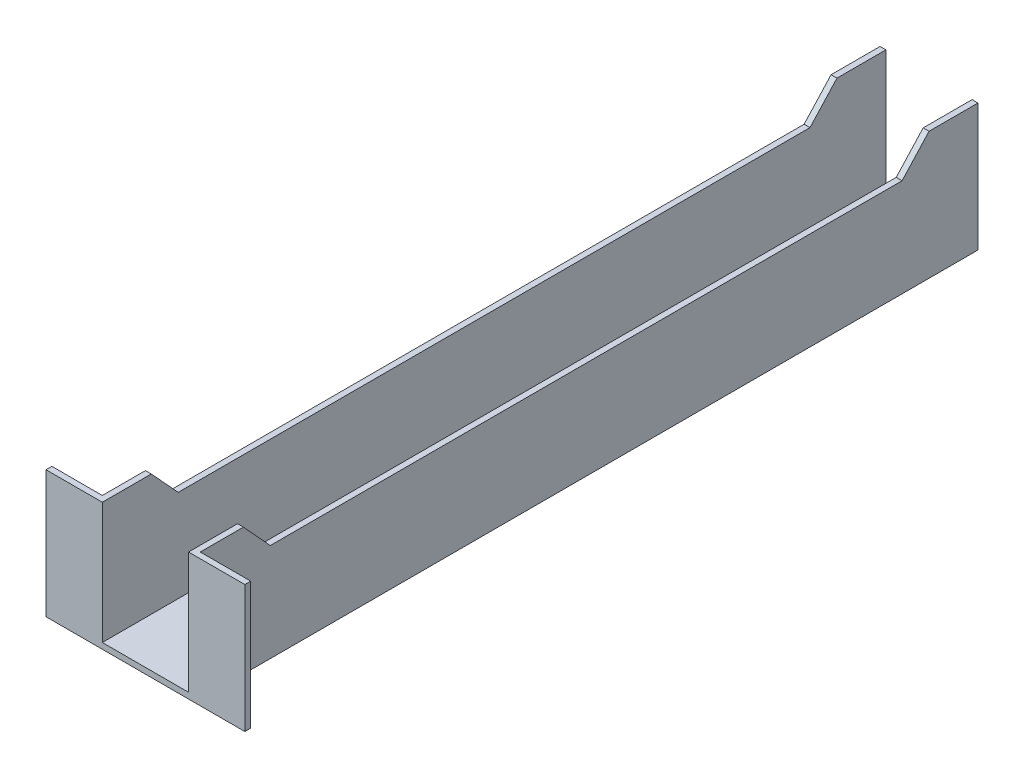
ISO-10303-21;
HEADER;
FILE_DESCRIPTION(('STEP AP214'),'2;1');
FILE_NAME('part.step','',(''),(''),'','','');
FILE_SCHEMA(('AUTOMOTIVE_DESIGN { 1 0 10303 214 1 1 1 1 }'));
ENDSEC;
DATA;
#1=APPLICATION_CONTEXT('core data for automotive mechanical design processes');
#2=APPLICATION_PROTOCOL_DEFINITION('international standard','automotive_design',2000,#1);
#3=PRODUCT_CONTEXT('',#1,'mechanical');
#4=PRODUCT('Part','Part','',(#3));
#5=PRODUCT_RELATED_PRODUCT_CATEGORY('part','',(#4));
#6=PRODUCT_DEFINITION_FORMATION('','',#4);
#7=PRODUCT_DEFINITION_CONTEXT('part definition',#1,'design');
#8=PRODUCT_DEFINITION('design','',#6,#7);
#9=PRODUCT_DEFINITION_SHAPE('','',#8);
#10=(LENGTH_UNIT() NAMED_UNIT(*) SI_UNIT(.MILLI.,.METRE.));
#11=(NAMED_UNIT(*) PLANE_ANGLE_UNIT() SI_UNIT($,.RADIAN.));
#12=(NAMED_UNIT(*) SI_UNIT($,.STERADIAN.) SOLID_ANGLE_UNIT());
#13=UNCERTAINTY_MEASURE_WITH_UNIT(LENGTH_MEASURE(1.E-05),#10,'distance_accuracy_value','');
#14=(GEOMETRIC_REPRESENTATION_CONTEXT(3) GLOBAL_UNCERTAINTY_ASSIGNED_CONTEXT((#13)) GLOBAL_UNIT_ASSIGNED_CONTEXT((#10,
#11,#12)) REPRESENTATION_CONTEXT('',''));
#15=CARTESIAN_POINT('',(0.,0.,0.));
#16=DIRECTION('',(0.,0.,1.));
#17=DIRECTION('',(1.,0.,0.));
#18=AXIS2_PLACEMENT_3D('',#15,#16,#17);
#19=CARTESIAN_POINT('',(-12.7,25.4,183.515));
#20=DIRECTION('',(0.,-1.,0.));
#21=DIRECTION('',(0.,0.,-1.));
#22=AXIS2_PLACEMENT_3D('',#19,#20,#21);
#23=PLANE('',#22);
#24=DIRECTION('',(0.,0.,1.));
#25=VECTOR('',#24,1.);
#26=CARTESIAN_POINT('',(-12.7,25.39999999238,100.838));
#27=LINE('',#26,#25);
#28=CARTESIAN_POINT('',(-12.7,25.39999999619,19.6850000034925));
#29=VERTEX_POINT('',#28);
#30=CARTESIAN_POINT('',(-12.7,25.39999999619,183.514999996507));
#31=VERTEX_POINT('',#30);
#32=EDGE_CURVE('E83',#29,#31,#27,.T.);
#33=ORIENTED_EDGE('',*,*,#32,.T.);
#34=DIRECTION('',(1.,0.,0.));
#35=VECTOR('',#34,1.);
#36=CARTESIAN_POINT('',(-11.938,25.4,183.515));
#37=LINE('',#36,#35);
#38=CARTESIAN_POINT('',(-11.176,25.399999997968,183.514999998137));
#39=VERTEX_POINT('',#38);
#40=EDGE_CURVE('E79',#31,#39,#37,.T.);
#41=ORIENTED_EDGE('',*,*,#40,.T.);
#42=DIRECTION('',(0.,0.,-1.));
#43=VECTOR('',#42,1.);
#44=CARTESIAN_POINT('',(-11.176,25.399999995936,101.6));
#45=LINE('',#44,#43);
#46=CARTESIAN_POINT('',(-11.176,25.399999997968,19.6850000018627));
#47=VERTEX_POINT('',#46);
#48=EDGE_CURVE('E82',#39,#47,#45,.T.);
#49=ORIENTED_EDGE('',*,*,#48,.T.);
#50=DIRECTION('',(1.,0.,0.));
#51=VECTOR('',#50,1.);
#52=CARTESIAN_POINT('',(-11.938,25.4,19.685));
#53=LINE('',#52,#51);
#54=EDGE_CURVE('E106',#29,#47,#53,.T.);
#55=ORIENTED_EDGE('',*,*,#54,.F.);
#56=EDGE_LOOP('',(#33,#41,#49,#55));
#57=FACE_BOUND('',#56,.T.);
#58=ADVANCED_FACE('F16',(#57),#23,.F.);
#59=CARTESIAN_POINT('',(-12.7,33.02,190.5));
#60=DIRECTION('',(0.,-0.675724628517347,0.737154140200741));
#61=DIRECTION('',(0.,-0.737154140200741,-0.675724628517347));
#62=AXIS2_PLACEMENT_3D('',#59,#60,#61);
#63=PLANE('',#62);
#64=DIRECTION('',(0.,-0.737154140200741,-0.675724628517347));
#65=VECTOR('',#64,1.);
#66=CARTESIAN_POINT('',(-12.7,33.02,190.5));
#67=LINE('',#66,#65);
#68=CARTESIAN_POINT('',(-12.7,33.02,190.5));
#69=VERTEX_POINT('',#68);
#70=EDGE_CURVE('E112',#31,#69,#67,.F.);
#71=ORIENTED_EDGE('',*,*,#70,.T.);
#72=DIRECTION('',(1.,0.,0.));
#73=VECTOR('',#72,1.);
#74=CARTESIAN_POINT('',(-18.4785,33.02,190.5));
#75=LINE('',#74,#73);
#76=CARTESIAN_POINT('',(-11.176,33.02,190.5));
#77=VERTEX_POINT('',#76);
#78=EDGE_CURVE('E73',#69,#77,#75,.T.);
#79=ORIENTED_EDGE('',*,*,#78,.T.);
#80=DIRECTION('',(0.,-0.737154140200741,-0.675724628517347));
#81=VECTOR('',#80,1.);
#82=CARTESIAN_POINT('',(-11.176,33.02,190.5));
#83=LINE('',#82,#81);
#84=EDGE_CURVE('E20',#77,#39,#83,.T.);
#85=ORIENTED_EDGE('',*,*,#84,.T.);
#86=ORIENTED_EDGE('',*,*,#40,.F.);
#87=EDGE_LOOP('',(#71,#79,#85,#86));
#88=FACE_BOUND('',#87,.T.);
#89=ADVANCED_FACE('F95',(#88),#63,.F.);
#90=CARTESIAN_POINT('',(-12.7,33.02,12.7));
#91=DIRECTION('',(0.,-1.,0.));
#92=DIRECTION('',(0.,0.,-1.));
#93=AXIS2_PLACEMENT_3D('',#90,#91,#92);
#94=PLANE('',#93);
#95=DIRECTION('',(0.,0.,-1.));
#96=VECTOR('',#95,1.);
#97=CARTESIAN_POINT('',(-11.176,33.02,101.6));
#98=LINE('',#97,#96);
#99=CARTESIAN_POINT('',(-11.176,33.02,12.7));
#100=VERTEX_POINT('',#99);
#101=CARTESIAN_POINT('',(-11.176,33.02,0.));
#102=VERTEX_POINT('',#101);
#103=EDGE_CURVE('E97',#100,#102,#98,.T.);
#104=ORIENTED_EDGE('',*,*,#103,.T.);
#105=DIRECTION('',(1.,0.,0.));
#106=VECTOR('',#105,1.);
#107=CARTESIAN_POINT('',(-11.938,33.02,0.));
#108=LINE('',#107,#106);
#109=CARTESIAN_POINT('',(-12.7,33.02,0.));
#110=VERTEX_POINT('',#109);
#111=EDGE_CURVE('E85',#110,#102,#108,.T.);
#112=ORIENTED_EDGE('',*,*,#111,.F.);
#113=DIRECTION('',(0.,0.,1.));
#114=VECTOR('',#113,1.);
#115=CARTESIAN_POINT('',(-12.7,33.02,100.838));
#116=LINE('',#115,#114);
#117=CARTESIAN_POINT('',(-12.7,33.02,12.7));
#118=VERTEX_POINT('',#117);
#119=EDGE_CURVE('E117',#110,#118,#116,.T.);
#120=ORIENTED_EDGE('',*,*,#119,.T.);
#121=DIRECTION('',(-1.,0.,0.));
#122=VECTOR('',#121,1.);
#123=CARTESIAN_POINT('',(-11.938,33.02,12.7));
#124=LINE('',#123,#122);
#125=EDGE_CURVE('E108',#100,#118,#124,.T.);
#126=ORIENTED_EDGE('',*,*,#125,.F.);
#127=EDGE_LOOP('',(#104,#112,#120,#126));
#128=FACE_BOUND('',#127,.T.);
#129=ADVANCED_FACE('F183',(#128),#94,.F.);
#130=CARTESIAN_POINT('',(-12.7,33.02,12.7));
#131=DIRECTION('',(0.,0.675724628517346,0.737154140200742));
#132=DIRECTION('',(0.,-0.737154140200742,0.675724628517346));
#133=AXIS2_PLACEMENT_3D('',#130,#131,#132);
#134=PLANE('',#133);
#135=DIRECTION('',(0.,-0.737154140200742,0.675724628517346));
#136=VECTOR('',#135,1.);
#137=CARTESIAN_POINT('',(-12.7,33.02,12.7));
#138=LINE('',#137,#136);
#139=EDGE_CURVE('E120',#118,#29,#138,.T.);
#140=ORIENTED_EDGE('',*,*,#139,.T.);
#141=ORIENTED_EDGE('',*,*,#54,.T.);
#142=DIRECTION('',(0.,-0.737154140200742,0.675724628517346));
#143=VECTOR('',#142,1.);
#144=CARTESIAN_POINT('',(-11.176,33.02,12.7));
#145=LINE('',#144,#143);
#146=EDGE_CURVE('E93',#47,#100,#145,.F.);
#147=ORIENTED_EDGE('',*,*,#146,.T.);
#148=ORIENTED_EDGE('',*,*,#125,.T.);
#149=EDGE_LOOP('',(#140,#141,#147,#148));
#150=FACE_BOUND('',#149,.T.);
#151=ADVANCED_FACE('F336',(#150),#134,.T.);
#152=CARTESIAN_POINT('',(-25.781,33.02,203.2));
#153=DIRECTION('',(-1.,0.,0.));
#154=DIRECTION('',(0.,0.,-1.));
#155=AXIS2_PLACEMENT_3D('',#152,#153,#154);
#156=PLANE('',#155);
#157=DIRECTION('',(0.,1.,0.));
#158=VECTOR('',#157,1.);
#159=CARTESIAN_POINT('',(-25.781,16.51,201.676));
#160=LINE('',#159,#158);
#161=CARTESIAN_POINT('',(-25.781,0.,201.676));
#162=VERTEX_POINT('',#161);
#163=CARTESIAN_POINT('',(-25.781,33.02,201.676));
#164=VERTEX_POINT('',#163);
#165=EDGE_CURVE('E218',#162,#164,#160,.T.);
#166=ORIENTED_EDGE('',*,*,#165,.F.);
#167=DIRECTION('',(0.,0.,1.));
#168=VECTOR('',#167,1.);
#169=CARTESIAN_POINT('',(-25.781,0.,202.438));
#170=LINE('',#169,#168);
#171=CARTESIAN_POINT('',(-25.781,0.,203.2));
#172=VERTEX_POINT('',#171);
#173=EDGE_CURVE('E107',#162,#172,#170,.T.);
#174=ORIENTED_EDGE('',*,*,#173,.T.);
#175=DIRECTION('',(0.,1.,0.));
#176=VECTOR('',#175,1.);
#177=CARTESIAN_POINT('',(-25.781,16.51,203.2));
#178=LINE('',#177,#176);
#179=CARTESIAN_POINT('',(-25.781,33.02,203.2));
#180=VERTEX_POINT('',#179);
#181=EDGE_CURVE('E210',#172,#180,#178,.T.);
#182=ORIENTED_EDGE('',*,*,#181,.T.);
#183=DIRECTION('',(0.,0.,-1.));
#184=VECTOR('',#183,1.);
#185=CARTESIAN_POINT('',(-25.781,33.02,196.85));
#186=LINE('',#185,#184);
#187=EDGE_CURVE('E161',#180,#164,#186,.T.);
#188=ORIENTED_EDGE('',*,*,#187,.T.);
#189=EDGE_LOOP('',(#166,#174,#182,#188));
#190=FACE_BOUND('',#189,.T.);
#191=ADVANCED_FACE('F338',(#190),#156,.T.);
#192=CARTESIAN_POINT('',(-25.781,33.02,203.2));
#193=DIRECTION('',(0.,-1.,0.));
#194=DIRECTION('',(0.,0.,-1.));
#195=AXIS2_PLACEMENT_3D('',#192,#193,#194);
#196=PLANE('',#195);
#197=ORIENTED_EDGE('',*,*,#78,.F.);
#198=DIRECTION('',(0.,0.,1.));
#199=VECTOR('',#198,1.);
#200=CARTESIAN_POINT('',(-12.7,33.02,100.838));
#201=LINE('',#200,#199);
#202=CARTESIAN_POINT('',(-12.6999999996825,33.02,201.676));
#203=VERTEX_POINT('',#202);
#204=EDGE_CURVE('E114',#69,#203,#201,.T.);
#205=ORIENTED_EDGE('',*,*,#204,.T.);
#206=DIRECTION('',(1.,0.,0.));
#207=VECTOR('',#206,1.);
#208=CARTESIAN_POINT('',(-19.2405,33.02,201.676));
#209=LINE('',#208,#207);
#210=EDGE_CURVE('E216',#164,#203,#209,.T.);
#211=ORIENTED_EDGE('',*,*,#210,.F.);
#212=ORIENTED_EDGE('',*,*,#187,.F.);
#213=DIRECTION('',(1.,0.,0.));
#214=VECTOR('',#213,1.);
#215=CARTESIAN_POINT('',(0.,33.02,203.2));
#216=LINE('',#215,#214);
#217=CARTESIAN_POINT('',(-11.175999993904,33.02,203.2));
#218=VERTEX_POINT('',#217);
#219=EDGE_CURVE('E208',#180,#218,#216,.T.);
#220=ORIENTED_EDGE('',*,*,#219,.T.);
#221=DIRECTION('',(0.,0.,-1.));
#222=VECTOR('',#221,1.);
#223=CARTESIAN_POINT('',(-11.176,33.02,101.6));
#224=LINE('',#223,#222);
#225=EDGE_CURVE('E96',#218,#77,#224,.T.);
#226=ORIENTED_EDGE('',*,*,#225,.T.);
#227=EDGE_LOOP('',(#197,#205,#211,#212,#220,#226));
#228=FACE_BOUND('',#227,.T.);
#229=ADVANCED_FACE('F334',(#228),#196,.F.);
#230=CARTESIAN_POINT('',(-11.176,1.524,0.));
#231=DIRECTION('',(-1.,0.,0.));
#232=DIRECTION('',(0.,0.,1.));
#233=AXIS2_PLACEMENT_3D('',#230,#231,#232);
#234=PLANE('',#233);
#235=ORIENTED_EDGE('',*,*,#48,.F.);
#236=ORIENTED_EDGE('',*,*,#84,.F.);
#237=ORIENTED_EDGE('',*,*,#225,.F.);
#238=DIRECTION('',(0.,-1.,0.));
#239=VECTOR('',#238,1.);
#240=CARTESIAN_POINT('',(-11.175999975616,16.51,203.2));
#241=LINE('',#240,#239);
#242=CARTESIAN_POINT('',(-11.175999993904,1.52399999873,203.2));
#243=VERTEX_POINT('',#242);
#244=EDGE_CURVE('E206',#218,#243,#241,.T.);
#245=ORIENTED_EDGE('',*,*,#244,.T.);
#246=DIRECTION('',(0.,0.,-1.));
#247=VECTOR('',#246,1.);
#248=CARTESIAN_POINT('',(-11.176,1.524,101.6));
#249=LINE('',#248,#247);
#250=CARTESIAN_POINT('',(-11.176,1.52399999873,0.));
#251=VERTEX_POINT('',#250);
#252=EDGE_CURVE('E113',#243,#251,#249,.T.);
#253=ORIENTED_EDGE('',*,*,#252,.T.);
#254=DIRECTION('',(0.,-1.,0.));
#255=VECTOR('',#254,1.);
#256=CARTESIAN_POINT('',(-11.176,16.51,0.));
#257=LINE('',#256,#255);
#258=EDGE_CURVE('E174',#102,#251,#257,.T.);
#259=ORIENTED_EDGE('',*,*,#258,.F.);
#260=ORIENTED_EDGE('',*,*,#103,.F.);
#261=ORIENTED_EDGE('',*,*,#146,.F.);
#262=EDGE_LOOP('',(#235,#236,#237,#245,#253,#259,#260,#261));
#263=FACE_BOUND('',#262,.T.);
#264=ADVANCED_FACE('F89',(#263),#234,.F.);
#265=CARTESIAN_POINT('',(-11.176,1.524,203.2));
#266=DIRECTION('',(0.,-1.,0.));
#267=DIRECTION('',(0.,0.,-1.));
#268=AXIS2_PLACEMENT_3D('',#265,#266,#267);
#269=PLANE('',#268);
#270=ORIENTED_EDGE('',*,*,#252,.F.);
#271=DIRECTION('',(1.,0.,0.));
#272=VECTOR('',#271,1.);
#273=CARTESIAN_POINT('',(0.,1.52399999492,203.2));
#274=LINE('',#273,#272);
#275=CARTESIAN_POINT('',(11.175999987808,1.52399999746,203.2));
#276=VERTEX_POINT('',#275);
#277=EDGE_CURVE('E203',#243,#276,#274,.T.);
#278=ORIENTED_EDGE('',*,*,#277,.T.);
#279=DIRECTION('',(0.,0.,-1.));
#280=VECTOR('',#279,1.);
#281=CARTESIAN_POINT('',(11.176,1.524,101.6));
#282=LINE('',#281,#280);
#283=CARTESIAN_POINT('',(11.176,1.52399999873,0.));
#284=VERTEX_POINT('',#283);
#285=EDGE_CURVE('E194',#276,#284,#282,.T.);
#286=ORIENTED_EDGE('',*,*,#285,.T.);
#287=DIRECTION('',(1.,0.,0.));
#288=VECTOR('',#287,1.);
#289=CARTESIAN_POINT('',(0.,1.52399999492,0.));
#290=LINE('',#289,#288);
#291=EDGE_CURVE('E184',#251,#284,#290,.T.);
#292=ORIENTED_EDGE('',*,*,#291,.F.);
#293=EDGE_LOOP('',(#270,#278,#286,#292));
#294=FACE_BOUND('',#293,.T.);
#295=ADVANCED_FACE('F389',(#294),#269,.F.);
#296=CARTESIAN_POINT('',(-12.7,0.,201.676));
#297=DIRECTION('',(1.,0.,0.));
#298=DIRECTION('',(0.,0.,-1.));
#299=AXIS2_PLACEMENT_3D('',#296,#297,#298);
#300=PLANE('',#299);
#301=ORIENTED_EDGE('',*,*,#119,.F.);
#302=DIRECTION('',(0.,1.,0.));
#303=VECTOR('',#302,1.);
#304=CARTESIAN_POINT('',(-12.7,16.51,0.));
#305=LINE('',#304,#303);
#306=CARTESIAN_POINT('',(-12.7000000036195,0.,0.));
#307=VERTEX_POINT('',#306);
#308=EDGE_CURVE('E178',#307,#110,#305,.T.);
#309=ORIENTED_EDGE('',*,*,#308,.F.);
#310=DIRECTION('',(0.,0.,1.));
#311=VECTOR('',#310,1.);
#312=CARTESIAN_POINT('',(-12.700000014478,0.,101.6));
#313=LINE('',#312,#311);
#314=CARTESIAN_POINT('',(-12.7000000036195,0.,201.676));
#315=VERTEX_POINT('',#314);
#316=EDGE_CURVE('E243',#307,#315,#313,.T.);
#317=ORIENTED_EDGE('',*,*,#316,.T.);
#318=DIRECTION('',(0.,-1.,0.));
#319=VECTOR('',#318,1.);
#320=CARTESIAN_POINT('',(-12.7,16.51,201.676));
#321=LINE('',#320,#319);
#322=EDGE_CURVE('E149',#203,#315,#321,.T.);
#323=ORIENTED_EDGE('',*,*,#322,.F.);
#324=ORIENTED_EDGE('',*,*,#204,.F.);
#325=ORIENTED_EDGE('',*,*,#70,.F.);
#326=ORIENTED_EDGE('',*,*,#32,.F.);
#327=ORIENTED_EDGE('',*,*,#139,.F.);
#328=EDGE_LOOP('',(#301,#309,#317,#323,#324,#325,#326,#327));
#329=FACE_BOUND('',#328,.T.);
#330=ADVANCED_FACE('F247',(#329),#300,.F.);
#331=CARTESIAN_POINT('',(-12.7,0.,201.676));
#332=DIRECTION('',(0.,0.,-1.));
#333=DIRECTION('',(-1.,0.,0.));
#334=AXIS2_PLACEMENT_3D('',#331,#332,#333);
#335=PLANE('',#334);
#336=ORIENTED_EDGE('',*,*,#165,.T.);
#337=ORIENTED_EDGE('',*,*,#210,.T.);
#338=ORIENTED_EDGE('',*,*,#322,.T.);
#339=DIRECTION('',(-1.,0.,0.));
#340=VECTOR('',#339,1.);
#341=CARTESIAN_POINT('',(0.,0.,201.676));
#342=LINE('',#341,#340);
#343=EDGE_CURVE('E230',#315,#162,#342,.T.);
#344=ORIENTED_EDGE('',*,*,#343,.T.);
#345=EDGE_LOOP('',(#336,#337,#338,#344));
#346=FACE_BOUND('',#345,.T.);
#347=ADVANCED_FACE('F228',(#346),#335,.T.);
#348=CARTESIAN_POINT('',(25.781,0.,203.2));
#349=DIRECTION('',(1.,0.,0.));
#350=DIRECTION('',(0.,0.,-1.));
#351=AXIS2_PLACEMENT_3D('',#348,#349,#350);
#352=PLANE('',#351);
#353=DIRECTION('',(0.,1.,0.));
#354=VECTOR('',#353,1.);
#355=CARTESIAN_POINT('',(25.781,16.51,201.676));
#356=LINE('',#355,#354);
#357=CARTESIAN_POINT('',(25.781,0.,201.676));
#358=VERTEX_POINT('',#357);
#359=CARTESIAN_POINT('',(25.781,33.02,201.676));
#360=VERTEX_POINT('',#359);
#361=EDGE_CURVE('E294',#358,#360,#356,.T.);
#362=ORIENTED_EDGE('',*,*,#361,.T.);
#363=DIRECTION('',(0.,0.,1.));
#364=VECTOR('',#363,1.);
#365=CARTESIAN_POINT('',(25.781,33.02,202.438));
#366=LINE('',#365,#364);
#367=CARTESIAN_POINT('',(25.781,33.02,203.2));
#368=VERTEX_POINT('',#367);
#369=EDGE_CURVE('E213',#360,#368,#366,.T.);
#370=ORIENTED_EDGE('',*,*,#369,.T.);
#371=DIRECTION('',(0.,-1.,0.));
#372=VECTOR('',#371,1.);
#373=CARTESIAN_POINT('',(25.781,16.51,203.2));
#374=LINE('',#373,#372);
#375=CARTESIAN_POINT('',(25.781,0.,203.2));
#376=VERTEX_POINT('',#375);
#377=EDGE_CURVE('E200',#368,#376,#374,.T.);
#378=ORIENTED_EDGE('',*,*,#377,.T.);
#379=DIRECTION('',(0.,0.,-1.));
#380=VECTOR('',#379,1.);
#381=CARTESIAN_POINT('',(25.781,0.,101.6));
#382=LINE('',#381,#380);
#383=EDGE_CURVE('E302',#376,#358,#382,.T.);
#384=ORIENTED_EDGE('',*,*,#383,.T.);
#385=EDGE_LOOP('',(#362,#370,#378,#384));
#386=FACE_BOUND('',#385,.T.);
#387=ADVANCED_FACE('F381',(#386),#352,.T.);
#388=CARTESIAN_POINT('',(25.781,0.,203.2));
#389=DIRECTION('',(0.,0.,-1.));
#390=DIRECTION('',(-1.,0.,0.));
#391=AXIS2_PLACEMENT_3D('',#388,#389,#390);
#392=PLANE('',#391);
#393=ORIENTED_EDGE('',*,*,#377,.F.);
#394=DIRECTION('',(-1.,0.,0.));
#395=VECTOR('',#394,1.);
#396=CARTESIAN_POINT('',(18.4785,33.02,203.2));
#397=LINE('',#396,#395);
#398=CARTESIAN_POINT('',(11.175999987808,33.02,203.2));
#399=VERTEX_POINT('',#398);
#400=EDGE_CURVE('E288',#368,#399,#397,.T.);
#401=ORIENTED_EDGE('',*,*,#400,.T.);
#402=DIRECTION('',(0.,-1.,0.));
#403=VECTOR('',#402,1.);
#404=CARTESIAN_POINT('',(11.176,17.272,203.2));
#405=LINE('',#404,#403);
#406=EDGE_CURVE('E197',#399,#276,#405,.T.);
#407=ORIENTED_EDGE('',*,*,#406,.T.);
#408=ORIENTED_EDGE('',*,*,#277,.F.);
#409=ORIENTED_EDGE('',*,*,#244,.F.);
#410=ORIENTED_EDGE('',*,*,#219,.F.);
#411=ORIENTED_EDGE('',*,*,#181,.F.);
#412=DIRECTION('',(1.,0.,0.));
#413=VECTOR('',#412,1.);
#414=CARTESIAN_POINT('',(0.,0.,203.2));
#415=LINE('',#414,#413);
#416=EDGE_CURVE('E245',#172,#376,#415,.T.);
#417=ORIENTED_EDGE('',*,*,#416,.T.);
#418=EDGE_LOOP('',(#393,#401,#407,#408,#409,#410,#411,#417));
#419=FACE_BOUND('',#418,.T.);
#420=ADVANCED_FACE('F309',(#419),#392,.F.);
#421=CARTESIAN_POINT('',(11.176,1.524,203.2));
#422=DIRECTION('',(1.,0.,0.));
#423=DIRECTION('',(0.,0.,-1.));
#424=AXIS2_PLACEMENT_3D('',#421,#422,#423);
#425=PLANE('',#424);
#426=DIRECTION('',(0.,0.,-1.));
#427=VECTOR('',#426,1.);
#428=CARTESIAN_POINT('',(11.176,33.02,6.35));
#429=LINE('',#428,#427);
#430=CARTESIAN_POINT('',(11.176,33.02,12.7));
#431=VERTEX_POINT('',#430);
#432=CARTESIAN_POINT('',(11.176,33.02,0.));
#433=VERTEX_POINT('',#432);
#434=EDGE_CURVE('E188',#431,#433,#429,.T.);
#435=ORIENTED_EDGE('',*,*,#434,.T.);
#436=DIRECTION('',(0.,1.,0.));
#437=VECTOR('',#436,1.);
#438=CARTESIAN_POINT('',(11.176,16.51,0.));
#439=LINE('',#438,#437);
#440=EDGE_CURVE('E186',#284,#433,#439,.T.);
#441=ORIENTED_EDGE('',*,*,#440,.F.);
#442=ORIENTED_EDGE('',*,*,#285,.F.);
#443=ORIENTED_EDGE('',*,*,#406,.F.);
#444=DIRECTION('',(0.,0.,-1.));
#445=VECTOR('',#444,1.);
#446=CARTESIAN_POINT('',(11.176,33.02,196.85));
#447=LINE('',#446,#445);
#448=CARTESIAN_POINT('',(11.176,33.02,190.5));
#449=VERTEX_POINT('',#448);
#450=EDGE_CURVE('E285',#399,#449,#447,.T.);
#451=ORIENTED_EDGE('',*,*,#450,.T.);
#452=DIRECTION('',(0.,-0.737154140200741,-0.675724628517347));
#453=VECTOR('',#452,1.);
#454=CARTESIAN_POINT('',(11.176,29.21,187.0075));
#455=LINE('',#454,#453);
#456=CARTESIAN_POINT('',(11.176,25.399999997968,183.515));
#457=VERTEX_POINT('',#456);
#458=EDGE_CURVE('E125',#449,#457,#455,.T.);
#459=ORIENTED_EDGE('',*,*,#458,.T.);
#460=DIRECTION('',(0.,0.,-1.));
#461=VECTOR('',#460,1.);
#462=CARTESIAN_POINT('',(11.176,25.4,101.6));
#463=LINE('',#462,#461);
#464=CARTESIAN_POINT('',(11.176,25.399999997968,19.685));
#465=VERTEX_POINT('',#464);
#466=EDGE_CURVE('E124',#457,#465,#463,.T.);
#467=ORIENTED_EDGE('',*,*,#466,.T.);
#468=DIRECTION('',(0.,-0.737154140200742,0.675724628517346));
#469=VECTOR('',#468,1.);
#470=CARTESIAN_POINT('',(11.176,29.21,16.1925));
#471=LINE('',#470,#469);
#472=EDGE_CURVE('E134',#431,#465,#471,.T.);
#473=ORIENTED_EDGE('',*,*,#472,.F.);
#474=EDGE_LOOP('',(#435,#441,#442,#443,#451,#459,#467,#473));
#475=FACE_BOUND('',#474,.T.);
#476=ADVANCED_FACE('F264',(#475),#425,.F.);
#477=CARTESIAN_POINT('',(11.176,33.02,12.7));
#478=DIRECTION('',(0.,-1.,0.));
#479=DIRECTION('',(0.,0.,-1.));
#480=AXIS2_PLACEMENT_3D('',#477,#478,#479);
#481=PLANE('',#480);
#482=DIRECTION('',(0.,0.,-1.));
#483=VECTOR('',#482,1.);
#484=CARTESIAN_POINT('',(12.7,33.02,100.838));
#485=LINE('',#484,#483);
#486=CARTESIAN_POINT('',(12.7,33.02,12.7));
#487=VERTEX_POINT('',#486);
#488=CARTESIAN_POINT('',(12.7,33.02,0.));
#489=VERTEX_POINT('',#488);
#490=EDGE_CURVE('E139',#487,#489,#485,.T.);
#491=ORIENTED_EDGE('',*,*,#490,.T.);
#492=DIRECTION('',(1.,0.,0.));
#493=VECTOR('',#492,1.);
#494=CARTESIAN_POINT('',(0.,33.02,0.));
#495=LINE('',#494,#493);
#496=EDGE_CURVE('E248',#433,#489,#495,.T.);
#497=ORIENTED_EDGE('',*,*,#496,.F.);
#498=ORIENTED_EDGE('',*,*,#434,.F.);
#499=DIRECTION('',(-1.,0.,0.));
#500=VECTOR('',#499,1.);
#501=CARTESIAN_POINT('',(11.938,33.02,12.7));
#502=LINE('',#501,#500);
#503=EDGE_CURVE('E138',#487,#431,#502,.T.);
#504=ORIENTED_EDGE('',*,*,#503,.F.);
#505=EDGE_LOOP('',(#491,#497,#498,#504));
#506=FACE_BOUND('',#505,.T.);
#507=ADVANCED_FACE('F269',(#506),#481,.F.);
#508=CARTESIAN_POINT('',(12.7,0.,0.));
#509=DIRECTION('',(0.,0.,-1.));
#510=DIRECTION('',(-1.,0.,0.));
#511=AXIS2_PLACEMENT_3D('',#508,#509,#510);
#512=PLANE('',#511);
#513=ORIENTED_EDGE('',*,*,#496,.T.);
#514=DIRECTION('',(0.,-1.,0.));
#515=VECTOR('',#514,1.);
#516=CARTESIAN_POINT('',(12.7,16.51,0.));
#517=LINE('',#516,#515);
#518=CARTESIAN_POINT('',(12.7000000036195,0.,0.));
#519=VERTEX_POINT('',#518);
#520=EDGE_CURVE('E142',#489,#519,#517,.T.);
#521=ORIENTED_EDGE('',*,*,#520,.T.);
#522=DIRECTION('',(-1.,0.,0.));
#523=VECTOR('',#522,1.);
#524=CARTESIAN_POINT('',(0.,0.,0.));
#525=LINE('',#524,#523);
#526=EDGE_CURVE('E300',#519,#307,#525,.T.);
#527=ORIENTED_EDGE('',*,*,#526,.T.);
#528=ORIENTED_EDGE('',*,*,#308,.T.);
#529=ORIENTED_EDGE('',*,*,#111,.T.);
#530=ORIENTED_EDGE('',*,*,#258,.T.);
#531=ORIENTED_EDGE('',*,*,#291,.T.);
#532=ORIENTED_EDGE('',*,*,#440,.T.);
#533=EDGE_LOOP('',(#513,#521,#527,#528,#529,#530,#531,#532));
#534=FACE_BOUND('',#533,.T.);
#535=ADVANCED_FACE('F172',(#534),#512,.T.);
#536=CARTESIAN_POINT('',(-25.781,0.,0.));
#537=DIRECTION('',(0.,1.,0.));
#538=DIRECTION('',(0.,0.,1.));
#539=AXIS2_PLACEMENT_3D('',#536,#537,#538);
#540=PLANE('',#539);
#541=DIRECTION('',(0.,0.,1.));
#542=VECTOR('',#541,1.);
#543=CARTESIAN_POINT('',(12.7,0.,100.838));
#544=LINE('',#543,#542);
#545=CARTESIAN_POINT('',(12.700000007239,0.,201.676));
#546=VERTEX_POINT('',#545);
#547=EDGE_CURVE('E276',#519,#546,#544,.T.);
#548=ORIENTED_EDGE('',*,*,#547,.T.);
#549=DIRECTION('',(1.,0.,0.));
#550=VECTOR('',#549,1.);
#551=CARTESIAN_POINT('',(19.2405,0.,201.676));
#552=LINE('',#551,#550);
#553=EDGE_CURVE('E297',#546,#358,#552,.T.);
#554=ORIENTED_EDGE('',*,*,#553,.T.);
#555=ORIENTED_EDGE('',*,*,#383,.F.);
#556=ORIENTED_EDGE('',*,*,#416,.F.);
#557=ORIENTED_EDGE('',*,*,#173,.F.);
#558=ORIENTED_EDGE('',*,*,#343,.F.);
#559=ORIENTED_EDGE('',*,*,#316,.F.);
#560=ORIENTED_EDGE('',*,*,#526,.F.);
#561=EDGE_LOOP('',(#548,#554,#555,#556,#557,#558,#559,#560));
#562=FACE_BOUND('',#561,.T.);
#563=ADVANCED_FACE('F241',(#562),#540,.F.);
#564=CARTESIAN_POINT('',(12.7,0.,201.676));
#565=DIRECTION('',(0.,0.,1.));
#566=DIRECTION('',(1.,0.,0.));
#567=AXIS2_PLACEMENT_3D('',#564,#565,#566);
#568=PLANE('',#567);
#569=DIRECTION('',(1.,0.,0.));
#570=VECTOR('',#569,1.);
#571=CARTESIAN_POINT('',(18.4785,33.02,201.676));
#572=LINE('',#571,#570);
#573=CARTESIAN_POINT('',(12.6999999996825,33.02,201.676));
#574=VERTEX_POINT('',#573);
#575=EDGE_CURVE('E291',#574,#360,#572,.T.);
#576=ORIENTED_EDGE('',*,*,#575,.T.);
#577=ORIENTED_EDGE('',*,*,#361,.F.);
#578=ORIENTED_EDGE('',*,*,#553,.F.);
#579=DIRECTION('',(0.,1.,0.));
#580=VECTOR('',#579,1.);
#581=CARTESIAN_POINT('',(12.7,16.51,201.676));
#582=LINE('',#581,#580);
#583=EDGE_CURVE('E130',#546,#574,#582,.T.);
#584=ORIENTED_EDGE('',*,*,#583,.T.);
#585=EDGE_LOOP('',(#576,#577,#578,#584));
#586=FACE_BOUND('',#585,.T.);
#587=ADVANCED_FACE('F366',(#586),#568,.F.);
#588=CARTESIAN_POINT('',(11.176,33.02,203.2));
#589=DIRECTION('',(0.,-1.,0.));
#590=DIRECTION('',(0.,0.,-1.));
#591=AXIS2_PLACEMENT_3D('',#588,#589,#590);
#592=PLANE('',#591);
#593=DIRECTION('',(-1.,0.,0.));
#594=VECTOR('',#593,1.);
#595=CARTESIAN_POINT('',(11.938,33.02,190.5));
#596=LINE('',#595,#594);
#597=CARTESIAN_POINT('',(12.6999999998413,33.02,190.5));
#598=VERTEX_POINT('',#597);
#599=EDGE_CURVE('E121',#598,#449,#596,.T.);
#600=ORIENTED_EDGE('',*,*,#599,.T.);
#601=ORIENTED_EDGE('',*,*,#450,.F.);
#602=ORIENTED_EDGE('',*,*,#400,.F.);
#603=ORIENTED_EDGE('',*,*,#369,.F.);
#604=ORIENTED_EDGE('',*,*,#575,.F.);
#605=DIRECTION('',(0.,0.,-1.));
#606=VECTOR('',#605,1.);
#607=CARTESIAN_POINT('',(12.7,33.02,100.838));
#608=LINE('',#607,#606);
#609=EDGE_CURVE('E126',#574,#598,#608,.T.);
#610=ORIENTED_EDGE('',*,*,#609,.T.);
#611=EDGE_LOOP('',(#600,#601,#602,#603,#604,#610));
#612=FACE_BOUND('',#611,.T.);
#613=ADVANCED_FACE('F362',(#612),#592,.F.);
#614=CARTESIAN_POINT('',(11.176,33.02,190.5));
#615=DIRECTION('',(0.,-0.675724628517347,0.737154140200741));
#616=DIRECTION('',(0.,-0.737154140200741,-0.675724628517347));
#617=AXIS2_PLACEMENT_3D('',#614,#615,#616);
#618=PLANE('',#617);
#619=DIRECTION('',(0.,-0.737154140200741,-0.675724628517347));
#620=VECTOR('',#619,1.);
#621=CARTESIAN_POINT('',(12.6999999996825,33.02,190.5));
#622=LINE('',#621,#620);
#623=CARTESIAN_POINT('',(12.6999999997619,25.39999999619,183.514999996507));
#624=VERTEX_POINT('',#623);
#625=EDGE_CURVE('E129',#598,#624,#622,.T.);
#626=ORIENTED_EDGE('',*,*,#625,.T.);
#627=DIRECTION('',(-1.,0.,0.));
#628=VECTOR('',#627,1.);
#629=CARTESIAN_POINT('',(11.938,25.4,183.515));
#630=LINE('',#629,#628);
#631=EDGE_CURVE('E131',#624,#457,#630,.T.);
#632=ORIENTED_EDGE('',*,*,#631,.T.);
#633=ORIENTED_EDGE('',*,*,#458,.F.);
#634=ORIENTED_EDGE('',*,*,#599,.F.);
#635=EDGE_LOOP('',(#626,#632,#633,#634));
#636=FACE_BOUND('',#635,.T.);
#637=ADVANCED_FACE('F356',(#636),#618,.F.);
#638=CARTESIAN_POINT('',(11.176,25.4,183.515));
#639=DIRECTION('',(0.,-1.,0.));
#640=DIRECTION('',(0.,0.,-1.));
#641=AXIS2_PLACEMENT_3D('',#638,#639,#640);
#642=PLANE('',#641);
#643=DIRECTION('',(0.,0.,-1.));
#644=VECTOR('',#643,1.);
#645=CARTESIAN_POINT('',(12.7,25.39999999238,100.838));
#646=LINE('',#645,#644);
#647=CARTESIAN_POINT('',(12.7,25.39999999619,19.6850000034925));
#648=VERTEX_POINT('',#647);
#649=EDGE_CURVE('E26',#624,#648,#646,.T.);
#650=ORIENTED_EDGE('',*,*,#649,.T.);
#651=DIRECTION('',(1.,0.,0.));
#652=VECTOR('',#651,1.);
#653=CARTESIAN_POINT('',(11.938,25.4,19.685));
#654=LINE('',#653,#652);
#655=EDGE_CURVE('E34',#465,#648,#654,.T.);
#656=ORIENTED_EDGE('',*,*,#655,.F.);
#657=ORIENTED_EDGE('',*,*,#466,.F.);
#658=ORIENTED_EDGE('',*,*,#631,.F.);
#659=EDGE_LOOP('',(#650,#656,#657,#658));
#660=FACE_BOUND('',#659,.T.);
#661=ADVANCED_FACE('F352',(#660),#642,.F.);
#662=CARTESIAN_POINT('',(11.176,33.02,12.7));
#663=DIRECTION('',(0.,0.675724628517346,0.737154140200742));
#664=DIRECTION('',(0.,-0.737154140200742,0.675724628517346));
#665=AXIS2_PLACEMENT_3D('',#662,#663,#664);
#666=PLANE('',#665);
#667=DIRECTION('',(0.,-0.737154140200742,0.675724628517346));
#668=VECTOR('',#667,1.);
#669=CARTESIAN_POINT('',(12.7,33.02,12.7));
#670=LINE('',#669,#668);
#671=EDGE_CURVE('E11',#648,#487,#670,.F.);
#672=ORIENTED_EDGE('',*,*,#671,.T.);
#673=ORIENTED_EDGE('',*,*,#503,.T.);
#674=ORIENTED_EDGE('',*,*,#472,.T.);
#675=ORIENTED_EDGE('',*,*,#655,.T.);
#676=EDGE_LOOP('',(#672,#673,#674,#675));
#677=FACE_BOUND('',#676,.T.);
#678=ADVANCED_FACE('F348',(#677),#666,.T.);
#679=CARTESIAN_POINT('',(12.7,0.,0.));
#680=DIRECTION('',(-1.,0.,0.));
#681=DIRECTION('',(0.,0.,1.));
#682=AXIS2_PLACEMENT_3D('',#679,#680,#681);
#683=PLANE('',#682);
#684=ORIENTED_EDGE('',*,*,#649,.F.);
#685=ORIENTED_EDGE('',*,*,#625,.F.);
#686=ORIENTED_EDGE('',*,*,#609,.F.);
#687=ORIENTED_EDGE('',*,*,#583,.F.);
#688=ORIENTED_EDGE('',*,*,#547,.F.);
#689=ORIENTED_EDGE('',*,*,#520,.F.);
#690=ORIENTED_EDGE('',*,*,#490,.F.);
#691=ORIENTED_EDGE('',*,*,#671,.F.);
#692=EDGE_LOOP('',(#684,#685,#686,#687,#688,#689,#690,#691));
#693=FACE_BOUND('',#692,.T.);
#694=ADVANCED_FACE('F18',(#693),#683,.F.);
#695=CLOSED_SHELL('',(#58,#89,#129,#151,#191,#229,#264,#295,#330,#347,#387,#420,#476,#507,#535,
#563,#587,#613,#637,#661,#678,#694));
#696=MANIFOLD_SOLID_BREP('B1',#695);
#697=ADVANCED_BREP_SHAPE_REPRESENTATION('',(#18,#696),#14);
#698=SHAPE_DEFINITION_REPRESENTATION(#9,#697);
ENDSEC;
END-ISO-10303-21;
